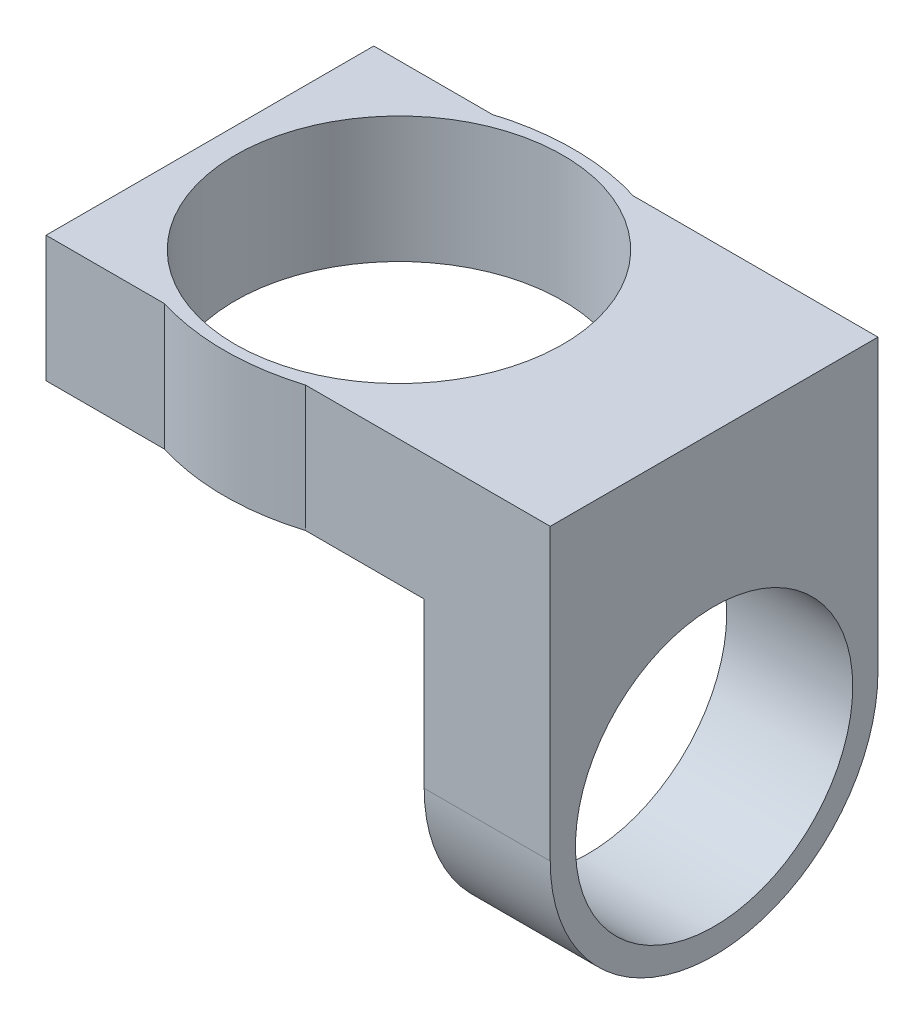
ISO-10303-21;
HEADER;
FILE_DESCRIPTION(('STEP AP214'),'2;1');
FILE_NAME('part.step','',(''),(''),'','','');
FILE_SCHEMA(('AUTOMOTIVE_DESIGN { 1 0 10303 214 1 1 1 1 }'));
ENDSEC;
DATA;
#1=APPLICATION_CONTEXT('core data for automotive mechanical design processes');
#2=APPLICATION_PROTOCOL_DEFINITION('international standard','automotive_design',2000,#1);
#3=PRODUCT_CONTEXT('',#1,'mechanical');
#4=PRODUCT('Part','Part','',(#3));
#5=PRODUCT_RELATED_PRODUCT_CATEGORY('part','',(#4));
#6=PRODUCT_DEFINITION_FORMATION('','',#4);
#7=PRODUCT_DEFINITION_CONTEXT('part definition',#1,'design');
#8=PRODUCT_DEFINITION('design','',#6,#7);
#9=PRODUCT_DEFINITION_SHAPE('','',#8);
#10=(LENGTH_UNIT() NAMED_UNIT(*) SI_UNIT(.MILLI.,.METRE.));
#11=(NAMED_UNIT(*) PLANE_ANGLE_UNIT() SI_UNIT($,.RADIAN.));
#12=(NAMED_UNIT(*) SI_UNIT($,.STERADIAN.) SOLID_ANGLE_UNIT());
#13=UNCERTAINTY_MEASURE_WITH_UNIT(LENGTH_MEASURE(1.E-05),#10,'distance_accuracy_value','');
#14=(GEOMETRIC_REPRESENTATION_CONTEXT(3) GLOBAL_UNCERTAINTY_ASSIGNED_CONTEXT((#13)) GLOBAL_UNIT_ASSIGNED_CONTEXT((#10,
#11,#12)) REPRESENTATION_CONTEXT('',''));
#15=CARTESIAN_POINT('',(0.,0.,0.));
#16=DIRECTION('',(0.,0.,1.));
#17=DIRECTION('',(1.,0.,0.));
#18=AXIS2_PLACEMENT_3D('',#15,#16,#17);
#19=CARTESIAN_POINT('',(10.,0.,0.));
#20=DIRECTION('',(-1.,0.,0.));
#21=DIRECTION('',(0.,0.,1.));
#22=AXIS2_PLACEMENT_3D('',#19,#20,#21);
#23=CYLINDRICAL_SURFACE('',#22,13.);
#24=DIRECTION('',(-1.,0.,0.));
#25=VECTOR('',#24,1.);
#26=CARTESIAN_POINT('',(10.,0.,-13.));
#27=LINE('',#26,#25);
#28=CARTESIAN_POINT('',(0.,0.,-13.));
#29=VERTEX_POINT('',#28);
#30=CARTESIAN_POINT('',(10.,0.,-13.));
#31=VERTEX_POINT('',#30);
#32=EDGE_CURVE('E48',#29,#31,#27,.F.);
#33=ORIENTED_EDGE('',*,*,#32,.T.);
#34=CARTESIAN_POINT('',(10.,0.,0.));
#35=DIRECTION('',(1.,0.,0.));
#36=DIRECTION('',(0.,0.,-1.));
#37=AXIS2_PLACEMENT_3D('',#34,#35,#36);
#38=CIRCLE('',#37,13.);
#39=CARTESIAN_POINT('',(10.,0.,13.));
#40=VERTEX_POINT('',#39);
#41=EDGE_CURVE('E11',#40,#31,#38,.T.);
#42=ORIENTED_EDGE('',*,*,#41,.F.);
#43=DIRECTION('',(-1.,0.,0.));
#44=VECTOR('',#43,1.);
#45=CARTESIAN_POINT('',(10.,0.,13.));
#46=LINE('',#45,#44);
#47=CARTESIAN_POINT('',(0.,0.,13.));
#48=VERTEX_POINT('',#47);
#49=EDGE_CURVE('E189',#48,#40,#46,.F.);
#50=ORIENTED_EDGE('',*,*,#49,.F.);
#51=CARTESIAN_POINT('',(0.,0.,0.));
#52=DIRECTION('',(1.,0.,0.));
#53=DIRECTION('',(0.,0.,-1.));
#54=AXIS2_PLACEMENT_3D('',#51,#52,#53);
#55=CIRCLE('',#54,13.);
#56=EDGE_CURVE('E37',#48,#29,#55,.T.);
#57=ORIENTED_EDGE('',*,*,#56,.T.);
#58=EDGE_LOOP('',(#33,#42,#50,#57));
#59=FACE_BOUND('',#58,.T.);
#60=ADVANCED_FACE('F34',(#59),#23,.T.);
#61=CARTESIAN_POINT('',(10.,0.,0.));
#62=DIRECTION('',(1.,0.,0.));
#63=DIRECTION('',(0.,0.,-1.));
#64=AXIS2_PLACEMENT_3D('',#61,#62,#63);
#65=PLANE('',#64);
#66=ORIENTED_EDGE('',*,*,#41,.T.);
#67=DIRECTION('',(0.,1.,0.));
#68=VECTOR('',#67,1.);
#69=CARTESIAN_POINT('',(10.,-13.001,-13.));
#70=LINE('',#69,#68);
#71=CARTESIAN_POINT('',(10.,23.,-13.));
#72=VERTEX_POINT('',#71);
#73=EDGE_CURVE('E120',#31,#72,#70,.T.);
#74=ORIENTED_EDGE('',*,*,#73,.T.);
#75=DIRECTION('',(0.,0.,-1.));
#76=VECTOR('',#75,1.);
#77=CARTESIAN_POINT('',(10.,23.,0.));
#78=LINE('',#77,#76);
#79=CARTESIAN_POINT('',(10.,23.,13.));
#80=VERTEX_POINT('',#79);
#81=EDGE_CURVE('E142',#80,#72,#78,.T.);
#82=ORIENTED_EDGE('',*,*,#81,.F.);
#83=DIRECTION('',(0.,1.,0.));
#84=VECTOR('',#83,1.);
#85=CARTESIAN_POINT('',(10.,-13.001,13.));
#86=LINE('',#85,#84);
#87=EDGE_CURVE('E192',#40,#80,#86,.T.);
#88=ORIENTED_EDGE('',*,*,#87,.F.);
#89=EDGE_LOOP('',(#66,#74,#82,#88));
#90=FACE_BOUND('',#89,.T.);
#91=CARTESIAN_POINT('',(10.,0.,0.));
#92=DIRECTION('',(1.,0.,0.));
#93=DIRECTION('',(0.,0.,-1.));
#94=AXIS2_PLACEMENT_3D('',#91,#92,#93);
#95=CIRCLE('',#94,11.);
#96=CARTESIAN_POINT('',(10.,0.,-11.));
#97=VERTEX_POINT('',#96);
#98=EDGE_CURVE('E198',#97,#97,#95,.T.);
#99=ORIENTED_EDGE('',*,*,#98,.F.);
#100=EDGE_LOOP('',(#99));
#101=FACE_BOUND('',#100,.T.);
#102=ADVANCED_FACE('F218',(#90,#101),#65,.T.);
#103=CARTESIAN_POINT('',(0.,0.,0.));
#104=DIRECTION('',(1.,0.,0.));
#105=DIRECTION('',(0.,0.,-1.));
#106=AXIS2_PLACEMENT_3D('',#103,#104,#105);
#107=PLANE('',#106);
#108=ORIENTED_EDGE('',*,*,#56,.F.);
#109=DIRECTION('',(0.,1.,0.));
#110=VECTOR('',#109,1.);
#111=CARTESIAN_POINT('',(0.,-13.001,13.));
#112=LINE('',#111,#110);
#113=CARTESIAN_POINT('',(0.,13.,13.));
#114=VERTEX_POINT('',#113);
#115=EDGE_CURVE('E195',#48,#114,#112,.T.);
#116=ORIENTED_EDGE('',*,*,#115,.T.);
#117=DIRECTION('',(0.,0.,1.));
#118=VECTOR('',#117,1.);
#119=CARTESIAN_POINT('',(0.,13.,0.));
#120=LINE('',#119,#118);
#121=CARTESIAN_POINT('',(0.,13.,-13.));
#122=VERTEX_POINT('',#121);
#123=EDGE_CURVE('E188',#122,#114,#120,.T.);
#124=ORIENTED_EDGE('',*,*,#123,.F.);
#125=DIRECTION('',(0.,1.,0.));
#126=VECTOR('',#125,1.);
#127=CARTESIAN_POINT('',(0.,-13.001,-13.));
#128=LINE('',#127,#126);
#129=EDGE_CURVE('E184',#29,#122,#128,.T.);
#130=ORIENTED_EDGE('',*,*,#129,.F.);
#131=EDGE_LOOP('',(#108,#116,#124,#130));
#132=FACE_BOUND('',#131,.T.);
#133=CARTESIAN_POINT('',(0.,0.,0.));
#134=DIRECTION('',(1.,0.,0.));
#135=DIRECTION('',(0.,0.,-1.));
#136=AXIS2_PLACEMENT_3D('',#133,#134,#135);
#137=CIRCLE('',#136,11.);
#138=CARTESIAN_POINT('',(0.,0.,-11.));
#139=VERTEX_POINT('',#138);
#140=EDGE_CURVE('E191',#139,#139,#137,.T.);
#141=ORIENTED_EDGE('',*,*,#140,.T.);
#142=EDGE_LOOP('',(#141));
#143=FACE_BOUND('',#142,.T.);
#144=ADVANCED_FACE('F204',(#132,#143),#107,.F.);
#145=CARTESIAN_POINT('',(10.,0.,0.));
#146=DIRECTION('',(-1.,0.,0.));
#147=DIRECTION('',(0.,0.,1.));
#148=AXIS2_PLACEMENT_3D('',#145,#146,#147);
#149=CYLINDRICAL_SURFACE('',#148,11.);
#150=ORIENTED_EDGE('',*,*,#98,.T.);
#151=EDGE_LOOP('',(#150));
#152=FACE_BOUND('',#151,.T.);
#153=ORIENTED_EDGE('',*,*,#140,.F.);
#154=EDGE_LOOP('',(#153));
#155=FACE_BOUND('',#154,.T.);
#156=ADVANCED_FACE('F206',(#152,#155),#149,.F.);
#157=CARTESIAN_POINT('',(0.,-13.001,13.));
#158=DIRECTION('',(0.,0.,-1.));
#159=DIRECTION('',(-1.,0.,0.));
#160=AXIS2_PLACEMENT_3D('',#157,#158,#159);
#161=PLANE('',#160);
#162=ORIENTED_EDGE('',*,*,#115,.F.);
#163=ORIENTED_EDGE('',*,*,#49,.T.);
#164=ORIENTED_EDGE('',*,*,#87,.T.);
#165=DIRECTION('',(-1.,0.,0.));
#166=VECTOR('',#165,1.);
#167=CARTESIAN_POINT('',(0.,23.,13.));
#168=LINE('',#167,#166);
#169=CARTESIAN_POINT('',(-9.41198123664818,23.,13.));
#170=VERTEX_POINT('',#169);
#171=EDGE_CURVE('E137',#80,#170,#168,.T.);
#172=ORIENTED_EDGE('',*,*,#171,.T.);
#173=DIRECTION('',(0.,-1.,0.));
#174=VECTOR('',#173,1.);
#175=CARTESIAN_POINT('',(-9.41198123664818,23.,13.));
#176=LINE('',#175,#174);
#177=CARTESIAN_POINT('',(-9.41198123664818,13.,13.));
#178=VERTEX_POINT('',#177);
#179=EDGE_CURVE('E179',#170,#178,#176,.T.);
#180=ORIENTED_EDGE('',*,*,#179,.T.);
#181=DIRECTION('',(-1.,0.,0.));
#182=VECTOR('',#181,1.);
#183=CARTESIAN_POINT('',(0.,13.,13.));
#184=LINE('',#183,#182);
#185=EDGE_CURVE('E161',#114,#178,#184,.T.);
#186=ORIENTED_EDGE('',*,*,#185,.F.);
#187=EDGE_LOOP('',(#162,#163,#164,#172,#180,#186));
#188=FACE_BOUND('',#187,.T.);
#189=ADVANCED_FACE('F208',(#188),#161,.F.);
#190=CARTESIAN_POINT('',(0.,-13.001,-13.));
#191=DIRECTION('',(0.,0.,1.));
#192=DIRECTION('',(1.,0.,0.));
#193=AXIS2_PLACEMENT_3D('',#190,#191,#192);
#194=PLANE('',#193);
#195=ORIENTED_EDGE('',*,*,#32,.F.);
#196=ORIENTED_EDGE('',*,*,#129,.T.);
#197=DIRECTION('',(1.,0.,0.));
#198=VECTOR('',#197,1.);
#199=CARTESIAN_POINT('',(0.,13.,-13.));
#200=LINE('',#199,#198);
#201=CARTESIAN_POINT('',(-9.41198123664818,13.,-13.));
#202=VERTEX_POINT('',#201);
#203=EDGE_CURVE('E163',#202,#122,#200,.T.);
#204=ORIENTED_EDGE('',*,*,#203,.F.);
#205=DIRECTION('',(0.,-1.,0.));
#206=VECTOR('',#205,1.);
#207=CARTESIAN_POINT('',(-9.41198123664818,23.,-13.));
#208=LINE('',#207,#206);
#209=CARTESIAN_POINT('',(-9.41198123664818,23.,-13.));
#210=VERTEX_POINT('',#209);
#211=EDGE_CURVE('E177',#210,#202,#208,.T.);
#212=ORIENTED_EDGE('',*,*,#211,.F.);
#213=DIRECTION('',(1.,0.,0.));
#214=VECTOR('',#213,1.);
#215=CARTESIAN_POINT('',(0.,23.,-13.));
#216=LINE('',#215,#214);
#217=EDGE_CURVE('E145',#210,#72,#216,.T.);
#218=ORIENTED_EDGE('',*,*,#217,.T.);
#219=ORIENTED_EDGE('',*,*,#73,.F.);
#220=EDGE_LOOP('',(#195,#196,#204,#212,#218,#219));
#221=FACE_BOUND('',#220,.T.);
#222=ADVANCED_FACE('F215',(#221),#194,.F.);
#223=CARTESIAN_POINT('',(0.,13.,0.));
#224=DIRECTION('',(0.,1.,0.));
#225=DIRECTION('',(0.,0.,1.));
#226=AXIS2_PLACEMENT_3D('',#223,#224,#225);
#227=PLANE('',#226);
#228=CARTESIAN_POINT('',(-15.,13.,0.));
#229=DIRECTION('',(0.,1.,0.));
#230=DIRECTION('',(0.,0.,1.));
#231=AXIS2_PLACEMENT_3D('',#228,#229,#230);
#232=CIRCLE('',#231,13.);
#233=CARTESIAN_POINT('',(-15.,13.,13.));
#234=VERTEX_POINT('',#233);
#235=EDGE_CURVE('E132',#234,#234,#232,.T.);
#236=ORIENTED_EDGE('',*,*,#235,.T.);
#237=EDGE_LOOP('',(#236));
#238=FACE_BOUND('',#237,.T.);
#239=ORIENTED_EDGE('',*,*,#203,.T.);
#240=ORIENTED_EDGE('',*,*,#123,.T.);
#241=ORIENTED_EDGE('',*,*,#185,.T.);
#242=CARTESIAN_POINT('',(-15.,13.,-5.0472547676192));
#243=DIRECTION('',(0.,1.,0.));
#244=DIRECTION('',(0.,0.,1.));
#245=AXIS2_PLACEMENT_3D('',#242,#243,#244);
#246=CIRCLE('',#245,18.8925741588309);
#247=CARTESIAN_POINT('',(-20.5880187633518,13.,13.));
#248=VERTEX_POINT('',#247);
#249=EDGE_CURVE('E158',#178,#248,#246,.F.);
#250=ORIENTED_EDGE('',*,*,#249,.T.);
#251=DIRECTION('',(-1.,0.,0.));
#252=VECTOR('',#251,1.);
#253=CARTESIAN_POINT('',(0.,13.,13.));
#254=LINE('',#253,#252);
#255=CARTESIAN_POINT('',(-30.,13.,13.));
#256=VERTEX_POINT('',#255);
#257=EDGE_CURVE('E156',#248,#256,#254,.T.);
#258=ORIENTED_EDGE('',*,*,#257,.T.);
#259=DIRECTION('',(0.,0.,-1.));
#260=VECTOR('',#259,1.);
#261=CARTESIAN_POINT('',(-30.,13.,0.));
#262=LINE('',#261,#260);
#263=CARTESIAN_POINT('',(-30.,13.,-13.));
#264=VERTEX_POINT('',#263);
#265=EDGE_CURVE('E115',#256,#264,#262,.T.);
#266=ORIENTED_EDGE('',*,*,#265,.T.);
#267=DIRECTION('',(1.,0.,0.));
#268=VECTOR('',#267,1.);
#269=CARTESIAN_POINT('',(0.,13.,-13.));
#270=LINE('',#269,#268);
#271=CARTESIAN_POINT('',(-20.5880187633518,13.,-13.));
#272=VERTEX_POINT('',#271);
#273=EDGE_CURVE('E169',#264,#272,#270,.T.);
#274=ORIENTED_EDGE('',*,*,#273,.T.);
#275=CARTESIAN_POINT('',(-15.,13.,5.0472547676192));
#276=DIRECTION('',(0.,1.,0.));
#277=DIRECTION('',(0.,0.,1.));
#278=AXIS2_PLACEMENT_3D('',#275,#276,#277);
#279=CIRCLE('',#278,18.8925741588309);
#280=EDGE_CURVE('E166',#202,#272,#279,.T.);
#281=ORIENTED_EDGE('',*,*,#280,.F.);
#282=EDGE_LOOP('',(#239,#240,#241,#250,#258,#266,#274,#281));
#283=FACE_BOUND('',#282,.T.);
#284=ADVANCED_FACE('F243',(#238,#283),#227,.F.);
#285=CARTESIAN_POINT('',(-30.,23.,0.));
#286=DIRECTION('',(-1.,0.,0.));
#287=DIRECTION('',(0.,0.,1.));
#288=AXIS2_PLACEMENT_3D('',#285,#286,#287);
#289=PLANE('',#288);
#290=ORIENTED_EDGE('',*,*,#265,.F.);
#291=DIRECTION('',(0.,-1.,0.));
#292=VECTOR('',#291,1.);
#293=CARTESIAN_POINT('',(-30.,23.,13.));
#294=LINE('',#293,#292);
#295=CARTESIAN_POINT('',(-30.,23.,13.));
#296=VERTEX_POINT('',#295);
#297=EDGE_CURVE('E109',#296,#256,#294,.T.);
#298=ORIENTED_EDGE('',*,*,#297,.F.);
#299=DIRECTION('',(0.,0.,-1.));
#300=VECTOR('',#299,1.);
#301=CARTESIAN_POINT('',(-30.,23.,0.));
#302=LINE('',#301,#300);
#303=CARTESIAN_POINT('',(-30.,23.,-13.));
#304=VERTEX_POINT('',#303);
#305=EDGE_CURVE('E112',#296,#304,#302,.T.);
#306=ORIENTED_EDGE('',*,*,#305,.T.);
#307=DIRECTION('',(0.,-1.,0.));
#308=VECTOR('',#307,1.);
#309=CARTESIAN_POINT('',(-30.,23.,-13.));
#310=LINE('',#309,#308);
#311=EDGE_CURVE('E154',#304,#264,#310,.T.);
#312=ORIENTED_EDGE('',*,*,#311,.T.);
#313=EDGE_LOOP('',(#290,#298,#306,#312));
#314=FACE_BOUND('',#313,.T.);
#315=ADVANCED_FACE('F111',(#314),#289,.T.);
#316=CARTESIAN_POINT('',(0.,23.,13.));
#317=DIRECTION('',(0.,0.,1.));
#318=DIRECTION('',(1.,0.,0.));
#319=AXIS2_PLACEMENT_3D('',#316,#317,#318);
#320=PLANE('',#319);
#321=ORIENTED_EDGE('',*,*,#257,.F.);
#322=DIRECTION('',(0.,-1.,0.));
#323=VECTOR('',#322,1.);
#324=CARTESIAN_POINT('',(-20.5880187633518,23.,13.));
#325=LINE('',#324,#323);
#326=CARTESIAN_POINT('',(-20.5880187633518,23.,13.));
#327=VERTEX_POINT('',#326);
#328=EDGE_CURVE('E121',#327,#248,#325,.T.);
#329=ORIENTED_EDGE('',*,*,#328,.F.);
#330=DIRECTION('',(-1.,0.,0.));
#331=VECTOR('',#330,1.);
#332=CARTESIAN_POINT('',(0.,23.,13.));
#333=LINE('',#332,#331);
#334=EDGE_CURVE('E128',#327,#296,#333,.T.);
#335=ORIENTED_EDGE('',*,*,#334,.T.);
#336=ORIENTED_EDGE('',*,*,#297,.T.);
#337=EDGE_LOOP('',(#321,#329,#335,#336));
#338=FACE_BOUND('',#337,.T.);
#339=ADVANCED_FACE('F134',(#338),#320,.T.);
#340=CARTESIAN_POINT('',(-15.,23.,-5.0472547676192));
#341=DIRECTION('',(0.,-1.,0.));
#342=DIRECTION('',(0.,0.,-1.));
#343=AXIS2_PLACEMENT_3D('',#340,#341,#342);
#344=CYLINDRICAL_SURFACE('',#343,18.8925741588309);
#345=ORIENTED_EDGE('',*,*,#249,.F.);
#346=ORIENTED_EDGE('',*,*,#179,.F.);
#347=CARTESIAN_POINT('',(-15.,23.,-5.0472547676192));
#348=DIRECTION('',(0.,1.,0.));
#349=DIRECTION('',(0.,0.,1.));
#350=AXIS2_PLACEMENT_3D('',#347,#348,#349);
#351=CIRCLE('',#350,18.8925741588309);
#352=EDGE_CURVE('E135',#170,#327,#351,.F.);
#353=ORIENTED_EDGE('',*,*,#352,.T.);
#354=ORIENTED_EDGE('',*,*,#328,.T.);
#355=EDGE_LOOP('',(#345,#346,#353,#354));
#356=FACE_BOUND('',#355,.T.);
#357=ADVANCED_FACE('F250',(#356),#344,.T.);
#358=CARTESIAN_POINT('',(-15.,23.,5.0472547676192));
#359=DIRECTION('',(0.,-1.,0.));
#360=DIRECTION('',(0.,0.,-1.));
#361=AXIS2_PLACEMENT_3D('',#358,#359,#360);
#362=CYLINDRICAL_SURFACE('',#361,18.8925741588309);
#363=ORIENTED_EDGE('',*,*,#280,.T.);
#364=DIRECTION('',(0.,-1.,0.));
#365=VECTOR('',#364,1.);
#366=CARTESIAN_POINT('',(-20.5880187633518,23.,-13.));
#367=LINE('',#366,#365);
#368=CARTESIAN_POINT('',(-20.5880187633518,23.,-13.));
#369=VERTEX_POINT('',#368);
#370=EDGE_CURVE('E175',#369,#272,#367,.T.);
#371=ORIENTED_EDGE('',*,*,#370,.F.);
#372=CARTESIAN_POINT('',(-15.,23.,5.0472547676192));
#373=DIRECTION('',(0.,1.,0.));
#374=DIRECTION('',(0.,0.,1.));
#375=AXIS2_PLACEMENT_3D('',#372,#373,#374);
#376=CIRCLE('',#375,18.8925741588309);
#377=EDGE_CURVE('E148',#210,#369,#376,.T.);
#378=ORIENTED_EDGE('',*,*,#377,.F.);
#379=ORIENTED_EDGE('',*,*,#211,.T.);
#380=EDGE_LOOP('',(#363,#371,#378,#379));
#381=FACE_BOUND('',#380,.T.);
#382=ADVANCED_FACE('F246',(#381),#362,.T.);
#383=CARTESIAN_POINT('',(0.,23.,-13.));
#384=DIRECTION('',(0.,0.,-1.));
#385=DIRECTION('',(-1.,0.,0.));
#386=AXIS2_PLACEMENT_3D('',#383,#384,#385);
#387=PLANE('',#386);
#388=ORIENTED_EDGE('',*,*,#273,.F.);
#389=ORIENTED_EDGE('',*,*,#311,.F.);
#390=DIRECTION('',(1.,0.,0.));
#391=VECTOR('',#390,1.);
#392=CARTESIAN_POINT('',(0.,23.,-13.));
#393=LINE('',#392,#391);
#394=EDGE_CURVE('E131',#304,#369,#393,.T.);
#395=ORIENTED_EDGE('',*,*,#394,.T.);
#396=ORIENTED_EDGE('',*,*,#370,.T.);
#397=EDGE_LOOP('',(#388,#389,#395,#396));
#398=FACE_BOUND('',#397,.T.);
#399=ADVANCED_FACE('F248',(#398),#387,.T.);
#400=CARTESIAN_POINT('',(-15.,23.,0.));
#401=DIRECTION('',(0.,-1.,0.));
#402=DIRECTION('',(0.,0.,-1.));
#403=AXIS2_PLACEMENT_3D('',#400,#401,#402);
#404=CYLINDRICAL_SURFACE('',#403,13.);
#405=CARTESIAN_POINT('',(-15.,23.,0.));
#406=DIRECTION('',(0.,1.,0.));
#407=DIRECTION('',(0.,0.,1.));
#408=AXIS2_PLACEMENT_3D('',#405,#406,#407);
#409=CIRCLE('',#408,13.);
#410=CARTESIAN_POINT('',(-15.,23.,13.));
#411=VERTEX_POINT('',#410);
#412=EDGE_CURVE('E151',#411,#411,#409,.T.);
#413=ORIENTED_EDGE('',*,*,#412,.T.);
#414=EDGE_LOOP('',(#413));
#415=FACE_BOUND('',#414,.T.);
#416=ORIENTED_EDGE('',*,*,#235,.F.);
#417=EDGE_LOOP('',(#416));
#418=FACE_BOUND('',#417,.T.);
#419=ADVANCED_FACE('F273',(#415,#418),#404,.F.);
#420=CARTESIAN_POINT('',(0.,23.,0.));
#421=DIRECTION('',(0.,1.,0.));
#422=DIRECTION('',(0.,0.,1.));
#423=AXIS2_PLACEMENT_3D('',#420,#421,#422);
#424=PLANE('',#423);
#425=ORIENTED_EDGE('',*,*,#305,.F.);
#426=ORIENTED_EDGE('',*,*,#334,.F.);
#427=ORIENTED_EDGE('',*,*,#352,.F.);
#428=ORIENTED_EDGE('',*,*,#171,.F.);
#429=ORIENTED_EDGE('',*,*,#81,.T.);
#430=ORIENTED_EDGE('',*,*,#217,.F.);
#431=ORIENTED_EDGE('',*,*,#377,.T.);
#432=ORIENTED_EDGE('',*,*,#394,.F.);
#433=EDGE_LOOP('',(#425,#426,#427,#428,#429,#430,#431,#432));
#434=FACE_BOUND('',#433,.T.);
#435=ORIENTED_EDGE('',*,*,#412,.F.);
#436=EDGE_LOOP('',(#435));
#437=FACE_BOUND('',#436,.T.);
#438=ADVANCED_FACE('F125',(#434,#437),#424,.T.);
#439=CLOSED_SHELL('',(#60,#102,#144,#156,#189,#222,#284,#315,#339,#357,#382,#399,#419,#438));
#440=MANIFOLD_SOLID_BREP('B2',#439);
#441=ADVANCED_BREP_SHAPE_REPRESENTATION('',(#18,#440),#14);
#442=SHAPE_DEFINITION_REPRESENTATION(#9,#441);
ENDSEC;
END-ISO-10303-21;
